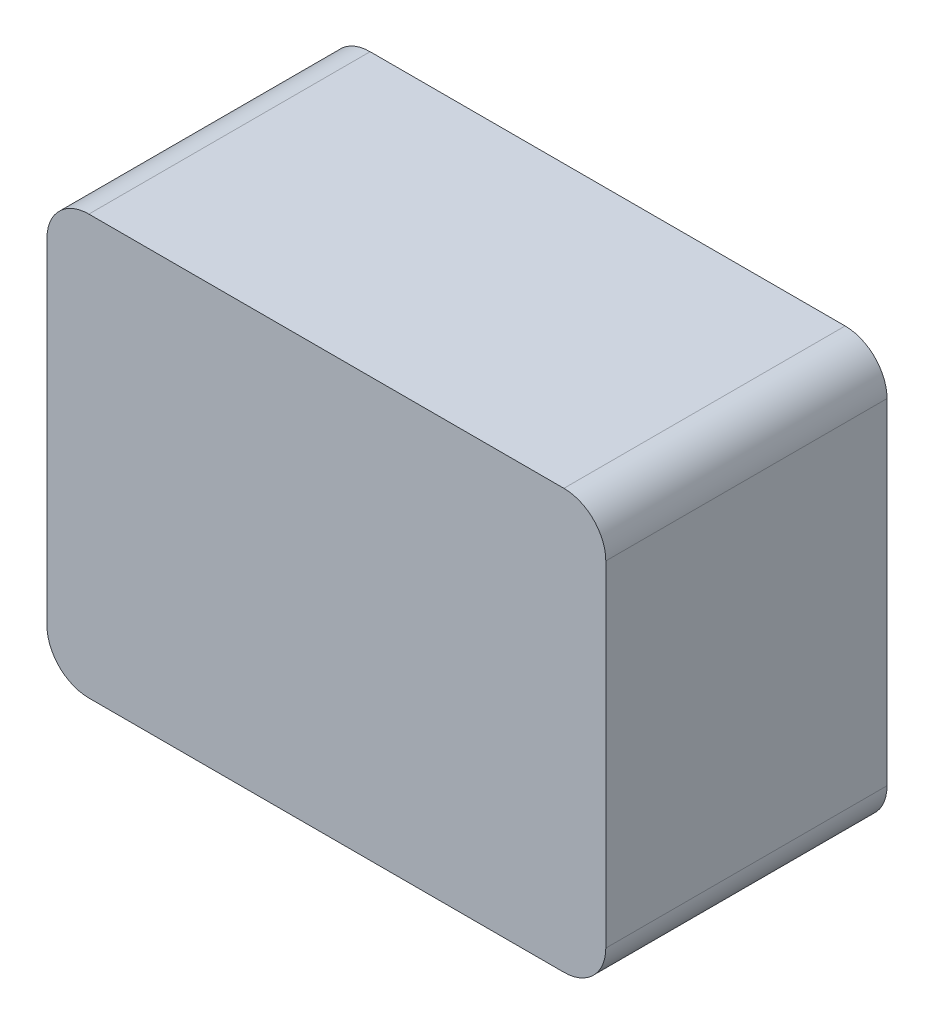
ISO-10303-21;
HEADER;
FILE_DESCRIPTION(('STEP AP214'),'2;1');
FILE_NAME('part.step','',(''),(''),'','','');
FILE_SCHEMA(('AUTOMOTIVE_DESIGN { 1 0 10303 214 1 1 1 1 }'));
ENDSEC;
DATA;
#1=APPLICATION_CONTEXT('core data for automotive mechanical design processes');
#2=APPLICATION_PROTOCOL_DEFINITION('international standard','automotive_design',2000,#1);
#3=PRODUCT_CONTEXT('',#1,'mechanical');
#4=PRODUCT('Part','Part','',(#3));
#5=PRODUCT_RELATED_PRODUCT_CATEGORY('part','',(#4));
#6=PRODUCT_DEFINITION_FORMATION('','',#4);
#7=PRODUCT_DEFINITION_CONTEXT('part definition',#1,'design');
#8=PRODUCT_DEFINITION('design','',#6,#7);
#9=PRODUCT_DEFINITION_SHAPE('','',#8);
#10=(LENGTH_UNIT() NAMED_UNIT(*) SI_UNIT(.MILLI.,.METRE.));
#11=(NAMED_UNIT(*) PLANE_ANGLE_UNIT() SI_UNIT($,.RADIAN.));
#12=(NAMED_UNIT(*) SI_UNIT($,.STERADIAN.) SOLID_ANGLE_UNIT());
#13=UNCERTAINTY_MEASURE_WITH_UNIT(LENGTH_MEASURE(1.E-05),#10,'distance_accuracy_value','');
#14=(GEOMETRIC_REPRESENTATION_CONTEXT(3) GLOBAL_UNCERTAINTY_ASSIGNED_CONTEXT((#13)) GLOBAL_UNIT_ASSIGNED_CONTEXT((#10,
#11,#12)) REPRESENTATION_CONTEXT('',''));
#15=CARTESIAN_POINT('',(0.,0.,0.));
#16=DIRECTION('',(0.,0.,1.));
#17=DIRECTION('',(1.,0.,0.));
#18=AXIS2_PLACEMENT_3D('',#15,#16,#17);
#19=CARTESIAN_POINT('',(30.57432310951,-75.,-238.));
#20=DIRECTION('',(1.,0.,0.));
#21=DIRECTION('',(0.,1.,0.));
#22=AXIS2_PLACEMENT_3D('',#19,#20,#21);
#23=PLANE('',#22);
#24=DIRECTION('',(0.,1.,0.));
#25=VECTOR('',#24,1.);
#26=CARTESIAN_POINT('',(30.57432310951,-75.,-137.352022777));
#27=LINE('',#26,#25);
#28=CARTESIAN_POINT('',(30.57432310951,-60.,-137.352022777));
#29=VERTEX_POINT('',#28);
#30=CARTESIAN_POINT('',(30.57432310951,60.,-137.352022777));
#31=VERTEX_POINT('',#30);
#32=EDGE_CURVE('E168',#29,#31,#27,.T.);
#33=ORIENTED_EDGE('',*,*,#32,.F.);
#34=DIRECTION('',(0.,0.,1.));
#35=VECTOR('',#34,1.);
#36=CARTESIAN_POINT('',(30.57432310951,-60.,-238.));
#37=LINE('',#36,#35);
#38=CARTESIAN_POINT('',(30.57432310951,-60.,-238.));
#39=VERTEX_POINT('',#38);
#40=EDGE_CURVE('E24',#39,#29,#37,.T.);
#41=ORIENTED_EDGE('',*,*,#40,.F.);
#42=DIRECTION('',(0.,1.,0.));
#43=VECTOR('',#42,1.);
#44=CARTESIAN_POINT('',(30.57432310951,-75.,-238.));
#45=LINE('',#44,#43);
#46=CARTESIAN_POINT('',(30.57432310951,60.,-238.));
#47=VERTEX_POINT('',#46);
#48=EDGE_CURVE('E151',#39,#47,#45,.T.);
#49=ORIENTED_EDGE('',*,*,#48,.T.);
#50=DIRECTION('',(0.,0.,1.));
#51=VECTOR('',#50,1.);
#52=CARTESIAN_POINT('',(30.57432310951,60.,-238.));
#53=LINE('',#52,#51);
#54=EDGE_CURVE('E10',#47,#31,#53,.T.);
#55=ORIENTED_EDGE('',*,*,#54,.T.);
#56=EDGE_LOOP('',(#33,#41,#49,#55));
#57=FACE_BOUND('',#56,.T.);
#58=ADVANCED_FACE('F16',(#57),#23,.T.);
#59=CARTESIAN_POINT('',(15.57432310951,60.,-238.));
#60=DIRECTION('',(0.,0.,1.));
#61=DIRECTION('',(1.,0.,0.));
#62=AXIS2_PLACEMENT_3D('',#59,#60,#61);
#63=CYLINDRICAL_SURFACE('',#62,15.);
#64=CARTESIAN_POINT('',(15.57432310951,60.,-238.));
#65=DIRECTION('',(0.,0.,1.));
#66=DIRECTION('',(0.,-1.,0.));
#67=AXIS2_PLACEMENT_3D('',#64,#65,#66);
#68=CIRCLE('',#67,15.);
#69=CARTESIAN_POINT('',(15.57432310951,75.,-238.));
#70=VERTEX_POINT('',#69);
#71=EDGE_CURVE('E154',#47,#70,#68,.T.);
#72=ORIENTED_EDGE('',*,*,#71,.T.);
#73=DIRECTION('',(0.,0.,1.));
#74=VECTOR('',#73,1.);
#75=CARTESIAN_POINT('',(15.57432310951,75.,-238.));
#76=LINE('',#75,#74);
#77=CARTESIAN_POINT('',(15.57432310951,75.,-137.352022777));
#78=VERTEX_POINT('',#77);
#79=EDGE_CURVE('E193',#70,#78,#76,.T.);
#80=ORIENTED_EDGE('',*,*,#79,.T.);
#81=CARTESIAN_POINT('',(15.57432310951,60.,-137.352022777));
#82=DIRECTION('',(0.,0.,1.));
#83=DIRECTION('',(0.,-1.,0.));
#84=AXIS2_PLACEMENT_3D('',#81,#82,#83);
#85=CIRCLE('',#84,15.);
#86=EDGE_CURVE('E164',#31,#78,#85,.T.);
#87=ORIENTED_EDGE('',*,*,#86,.F.);
#88=ORIENTED_EDGE('',*,*,#54,.F.);
#89=EDGE_LOOP('',(#72,#80,#87,#88));
#90=FACE_BOUND('',#89,.T.);
#91=ADVANCED_FACE('F224',(#90),#63,.T.);
#92=CARTESIAN_POINT('',(15.57432310951,-60.,-238.));
#93=DIRECTION('',(0.,0.,1.));
#94=DIRECTION('',(1.,0.,0.));
#95=AXIS2_PLACEMENT_3D('',#92,#93,#94);
#96=CYLINDRICAL_SURFACE('',#95,15.);
#97=ORIENTED_EDGE('',*,*,#40,.T.);
#98=CARTESIAN_POINT('',(15.57432310951,-60.,-137.352022777));
#99=DIRECTION('',(0.,0.,-1.));
#100=DIRECTION('',(0.,-1.,0.));
#101=AXIS2_PLACEMENT_3D('',#98,#99,#100);
#102=CIRCLE('',#101,15.);
#103=CARTESIAN_POINT('',(15.57432310951,-75.,-137.352022777));
#104=VERTEX_POINT('',#103);
#105=EDGE_CURVE('E167',#29,#104,#102,.T.);
#106=ORIENTED_EDGE('',*,*,#105,.T.);
#107=DIRECTION('',(0.,0.,1.));
#108=VECTOR('',#107,1.);
#109=CARTESIAN_POINT('',(15.57432310951,-75.,-238.));
#110=LINE('',#109,#108);
#111=CARTESIAN_POINT('',(15.57432310951,-75.,-238.));
#112=VERTEX_POINT('',#111);
#113=EDGE_CURVE('E36',#112,#104,#110,.T.);
#114=ORIENTED_EDGE('',*,*,#113,.F.);
#115=CARTESIAN_POINT('',(15.57432310951,-60.,-238.));
#116=DIRECTION('',(0.,0.,-1.));
#117=DIRECTION('',(0.,-1.,0.));
#118=AXIS2_PLACEMENT_3D('',#115,#116,#117);
#119=CIRCLE('',#118,15.);
#120=EDGE_CURVE('E153',#39,#112,#119,.T.);
#121=ORIENTED_EDGE('',*,*,#120,.F.);
#122=EDGE_LOOP('',(#97,#106,#114,#121));
#123=FACE_BOUND('',#122,.T.);
#124=ADVANCED_FACE('F197',(#123),#96,.T.);
#125=CARTESIAN_POINT('',(-169.42567689,75.,-238.));
#126=DIRECTION('',(0.,1.,0.));
#127=DIRECTION('',(1.,0.,0.));
#128=AXIS2_PLACEMENT_3D('',#125,#126,#127);
#129=PLANE('',#128);
#130=DIRECTION('',(1.,0.,0.));
#131=VECTOR('',#130,1.);
#132=CARTESIAN_POINT('',(-169.42567689,75.,-238.));
#133=LINE('',#132,#131);
#134=CARTESIAN_POINT('',(-154.42567689,75.,-238.));
#135=VERTEX_POINT('',#134);
#136=EDGE_CURVE('E83',#135,#70,#133,.T.);
#137=ORIENTED_EDGE('',*,*,#136,.F.);
#138=DIRECTION('',(0.,0.,1.));
#139=VECTOR('',#138,1.);
#140=CARTESIAN_POINT('',(-154.42567689,75.,-238.));
#141=LINE('',#140,#139);
#142=CARTESIAN_POINT('',(-154.42567689,75.,-137.352022777));
#143=VERTEX_POINT('',#142);
#144=EDGE_CURVE('E179',#135,#143,#141,.T.);
#145=ORIENTED_EDGE('',*,*,#144,.T.);
#146=DIRECTION('',(1.,0.,0.));
#147=VECTOR('',#146,1.);
#148=CARTESIAN_POINT('',(-169.42567689,75.,-137.352022777));
#149=LINE('',#148,#147);
#150=EDGE_CURVE('E160',#143,#78,#149,.T.);
#151=ORIENTED_EDGE('',*,*,#150,.T.);
#152=ORIENTED_EDGE('',*,*,#79,.F.);
#153=EDGE_LOOP('',(#137,#145,#151,#152));
#154=FACE_BOUND('',#153,.T.);
#155=ADVANCED_FACE('F219',(#154),#129,.T.);
#156=CARTESIAN_POINT('',(-169.42567689,-75.,-238.));
#157=DIRECTION('',(0.,1.,0.));
#158=DIRECTION('',(1.,0.,0.));
#159=AXIS2_PLACEMENT_3D('',#156,#157,#158);
#160=PLANE('',#159);
#161=ORIENTED_EDGE('',*,*,#113,.T.);
#162=DIRECTION('',(1.,0.,0.));
#163=VECTOR('',#162,1.);
#164=CARTESIAN_POINT('',(-169.42567689,-75.,-137.352022777));
#165=LINE('',#164,#163);
#166=CARTESIAN_POINT('',(-154.42567689,-75.,-137.352022777));
#167=VERTEX_POINT('',#166);
#168=EDGE_CURVE('E127',#167,#104,#165,.T.);
#169=ORIENTED_EDGE('',*,*,#168,.F.);
#170=DIRECTION('',(0.,0.,1.));
#171=VECTOR('',#170,1.);
#172=CARTESIAN_POINT('',(-154.42567689,-75.,-238.));
#173=LINE('',#172,#171);
#174=CARTESIAN_POINT('',(-154.42567689,-75.,-238.));
#175=VERTEX_POINT('',#174);
#176=EDGE_CURVE('E122',#175,#167,#173,.T.);
#177=ORIENTED_EDGE('',*,*,#176,.F.);
#178=DIRECTION('',(1.,0.,0.));
#179=VECTOR('',#178,1.);
#180=CARTESIAN_POINT('',(-169.42567689,-75.,-238.));
#181=LINE('',#180,#179);
#182=EDGE_CURVE('E94',#175,#112,#181,.T.);
#183=ORIENTED_EDGE('',*,*,#182,.T.);
#184=EDGE_LOOP('',(#161,#169,#177,#183));
#185=FACE_BOUND('',#184,.T.);
#186=ADVANCED_FACE('F211',(#185),#160,.F.);
#187=CARTESIAN_POINT('',(-169.42567689,-75.,-238.));
#188=DIRECTION('',(0.,0.,1.));
#189=DIRECTION('',(1.,0.,0.));
#190=AXIS2_PLACEMENT_3D('',#187,#188,#189);
#191=PLANE('',#190);
#192=CARTESIAN_POINT('',(-154.42567689,60.,-238.));
#193=DIRECTION('',(0.,0.,-1.));
#194=DIRECTION('',(0.,-1.,0.));
#195=AXIS2_PLACEMENT_3D('',#192,#193,#194);
#196=CIRCLE('',#195,15.);
#197=CARTESIAN_POINT('',(-169.42567689,60.,-238.));
#198=VERTEX_POINT('',#197);
#199=EDGE_CURVE('E158',#198,#135,#196,.T.);
#200=ORIENTED_EDGE('',*,*,#199,.T.);
#201=ORIENTED_EDGE('',*,*,#136,.T.);
#202=ORIENTED_EDGE('',*,*,#71,.F.);
#203=ORIENTED_EDGE('',*,*,#48,.F.);
#204=ORIENTED_EDGE('',*,*,#120,.T.);
#205=ORIENTED_EDGE('',*,*,#182,.F.);
#206=CARTESIAN_POINT('',(-154.42567689,-60.,-238.));
#207=DIRECTION('',(0.,0.,1.));
#208=DIRECTION('',(0.,-1.,0.));
#209=AXIS2_PLACEMENT_3D('',#206,#207,#208);
#210=CIRCLE('',#209,15.);
#211=CARTESIAN_POINT('',(-169.42567689,-60.,-238.));
#212=VERTEX_POINT('',#211);
#213=EDGE_CURVE('E110',#212,#175,#210,.T.);
#214=ORIENTED_EDGE('',*,*,#213,.F.);
#215=DIRECTION('',(0.,1.,0.));
#216=VECTOR('',#215,1.);
#217=CARTESIAN_POINT('',(-169.42567689,-75.,-238.));
#218=LINE('',#217,#216);
#219=EDGE_CURVE('E141',#212,#198,#218,.T.);
#220=ORIENTED_EDGE('',*,*,#219,.T.);
#221=EDGE_LOOP('',(#200,#201,#202,#203,#204,#205,#214,#220));
#222=FACE_BOUND('',#221,.T.);
#223=ADVANCED_FACE('F209',(#222),#191,.F.);
#224=CARTESIAN_POINT('',(-154.42567689,60.,-238.));
#225=DIRECTION('',(0.,0.,1.));
#226=DIRECTION('',(-1.,0.,0.));
#227=AXIS2_PLACEMENT_3D('',#224,#225,#226);
#228=CYLINDRICAL_SURFACE('',#227,15.);
#229=DIRECTION('',(0.,0.,1.));
#230=VECTOR('',#229,1.);
#231=CARTESIAN_POINT('',(-169.42567689,60.,-238.));
#232=LINE('',#231,#230);
#233=CARTESIAN_POINT('',(-169.42567689,60.,-137.352022777));
#234=VERTEX_POINT('',#233);
#235=EDGE_CURVE('E147',#198,#234,#232,.T.);
#236=ORIENTED_EDGE('',*,*,#235,.T.);
#237=CARTESIAN_POINT('',(-154.42567689,60.,-137.352022777));
#238=DIRECTION('',(0.,0.,-1.));
#239=DIRECTION('',(0.,-1.,0.));
#240=AXIS2_PLACEMENT_3D('',#237,#238,#239);
#241=CIRCLE('',#240,15.);
#242=EDGE_CURVE('E134',#234,#143,#241,.T.);
#243=ORIENTED_EDGE('',*,*,#242,.T.);
#244=ORIENTED_EDGE('',*,*,#144,.F.);
#245=ORIENTED_EDGE('',*,*,#199,.F.);
#246=EDGE_LOOP('',(#236,#243,#244,#245));
#247=FACE_BOUND('',#246,.T.);
#248=ADVANCED_FACE('F207',(#247),#228,.T.);
#249=CARTESIAN_POINT('',(-154.42567689,-60.,-238.));
#250=DIRECTION('',(0.,0.,1.));
#251=DIRECTION('',(-1.,0.,0.));
#252=AXIS2_PLACEMENT_3D('',#249,#250,#251);
#253=CYLINDRICAL_SURFACE('',#252,15.);
#254=ORIENTED_EDGE('',*,*,#213,.T.);
#255=ORIENTED_EDGE('',*,*,#176,.T.);
#256=CARTESIAN_POINT('',(-154.42567689,-60.,-137.352022777));
#257=DIRECTION('',(0.,0.,1.));
#258=DIRECTION('',(0.,-1.,0.));
#259=AXIS2_PLACEMENT_3D('',#256,#257,#258);
#260=CIRCLE('',#259,15.);
#261=CARTESIAN_POINT('',(-169.42567689,-60.,-137.352022777));
#262=VERTEX_POINT('',#261);
#263=EDGE_CURVE('E116',#262,#167,#260,.T.);
#264=ORIENTED_EDGE('',*,*,#263,.F.);
#265=DIRECTION('',(0.,0.,1.));
#266=VECTOR('',#265,1.);
#267=CARTESIAN_POINT('',(-169.42567689,-60.,-238.));
#268=LINE('',#267,#266);
#269=EDGE_CURVE('E120',#212,#262,#268,.T.);
#270=ORIENTED_EDGE('',*,*,#269,.F.);
#271=EDGE_LOOP('',(#254,#255,#264,#270));
#272=FACE_BOUND('',#271,.T.);
#273=ADVANCED_FACE('F118',(#272),#253,.T.);
#274=CARTESIAN_POINT('',(-169.42567689,-75.,-137.352022777));
#275=DIRECTION('',(0.,0.,1.));
#276=DIRECTION('',(1.,0.,0.));
#277=AXIS2_PLACEMENT_3D('',#274,#275,#276);
#278=PLANE('',#277);
#279=DIRECTION('',(0.,1.,0.));
#280=VECTOR('',#279,1.);
#281=CARTESIAN_POINT('',(-169.42567689,-75.,-137.352022777));
#282=LINE('',#281,#280);
#283=EDGE_CURVE('E128',#262,#234,#282,.T.);
#284=ORIENTED_EDGE('',*,*,#283,.F.);
#285=ORIENTED_EDGE('',*,*,#263,.T.);
#286=ORIENTED_EDGE('',*,*,#168,.T.);
#287=ORIENTED_EDGE('',*,*,#105,.F.);
#288=ORIENTED_EDGE('',*,*,#32,.T.);
#289=ORIENTED_EDGE('',*,*,#86,.T.);
#290=ORIENTED_EDGE('',*,*,#150,.F.);
#291=ORIENTED_EDGE('',*,*,#242,.F.);
#292=EDGE_LOOP('',(#284,#285,#286,#287,#288,#289,#290,#291));
#293=FACE_BOUND('',#292,.T.);
#294=ADVANCED_FACE('F131',(#293),#278,.T.);
#295=CARTESIAN_POINT('',(-169.42567689,-75.,-238.));
#296=DIRECTION('',(1.,0.,0.));
#297=DIRECTION('',(0.,1.,0.));
#298=AXIS2_PLACEMENT_3D('',#295,#296,#297);
#299=PLANE('',#298);
#300=ORIENTED_EDGE('',*,*,#235,.F.);
#301=ORIENTED_EDGE('',*,*,#219,.F.);
#302=ORIENTED_EDGE('',*,*,#269,.T.);
#303=ORIENTED_EDGE('',*,*,#283,.T.);
#304=EDGE_LOOP('',(#300,#301,#302,#303));
#305=FACE_BOUND('',#304,.T.);
#306=ADVANCED_FACE('F140',(#305),#299,.F.);
#307=CLOSED_SHELL('',(#58,#91,#124,#155,#186,#223,#248,#273,#294,#306));
#308=MANIFOLD_SOLID_BREP('B1',#307);
#309=ADVANCED_BREP_SHAPE_REPRESENTATION('',(#18,#308),#14);
#310=SHAPE_DEFINITION_REPRESENTATION(#9,#309);
ENDSEC;
END-ISO-10303-21;
